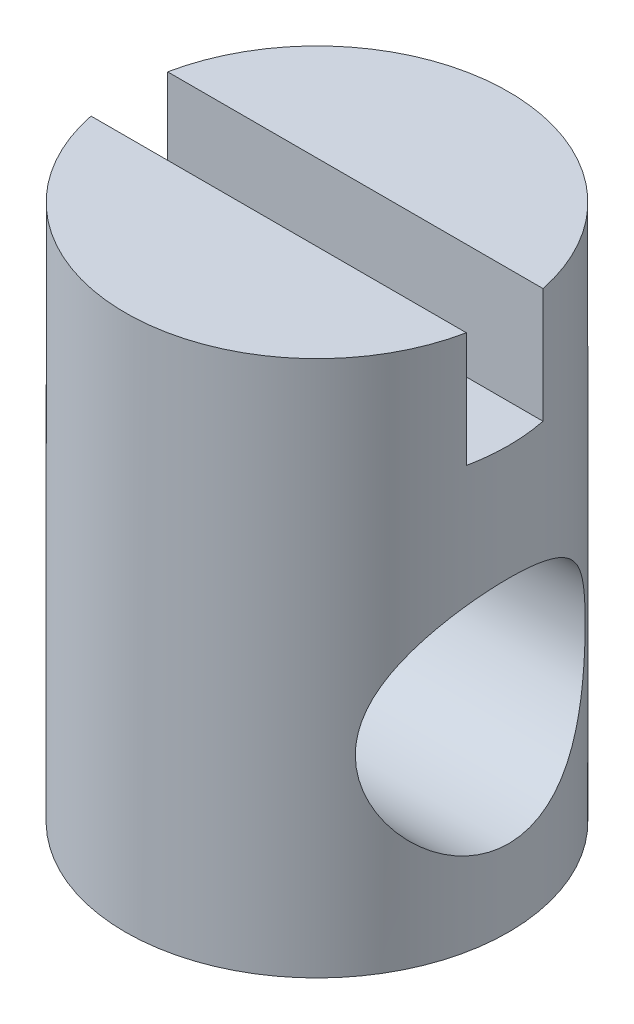
ISO-10303-21;
HEADER;
FILE_DESCRIPTION(('STEP AP214'),'2;1');
FILE_NAME('part.step','',(''),(''),'','','');
FILE_SCHEMA(('AUTOMOTIVE_DESIGN { 1 0 10303 214 1 1 1 1 }'));
ENDSEC;
DATA;
#1=APPLICATION_CONTEXT('core data for automotive mechanical design processes');
#2=APPLICATION_PROTOCOL_DEFINITION('international standard','automotive_design',2000,#1);
#3=PRODUCT_CONTEXT('',#1,'mechanical');
#4=PRODUCT('Part','Part','',(#3));
#5=PRODUCT_RELATED_PRODUCT_CATEGORY('part','',(#4));
#6=PRODUCT_DEFINITION_FORMATION('','',#4);
#7=PRODUCT_DEFINITION_CONTEXT('part definition',#1,'design');
#8=PRODUCT_DEFINITION('design','',#6,#7);
#9=PRODUCT_DEFINITION_SHAPE('','',#8);
#10=(LENGTH_UNIT() NAMED_UNIT(*) SI_UNIT(.MILLI.,.METRE.));
#11=(NAMED_UNIT(*) PLANE_ANGLE_UNIT() SI_UNIT($,.RADIAN.));
#12=(NAMED_UNIT(*) SI_UNIT($,.STERADIAN.) SOLID_ANGLE_UNIT());
#13=UNCERTAINTY_MEASURE_WITH_UNIT(LENGTH_MEASURE(1.E-05),#10,'distance_accuracy_value','');
#14=(GEOMETRIC_REPRESENTATION_CONTEXT(3) GLOBAL_UNCERTAINTY_ASSIGNED_CONTEXT((#13)) GLOBAL_UNIT_ASSIGNED_CONTEXT((#10,
#11,#12)) REPRESENTATION_CONTEXT('',''));
#15=CARTESIAN_POINT('',(0.,0.,0.));
#16=DIRECTION('',(0.,0.,1.));
#17=DIRECTION('',(1.,0.,0.));
#18=AXIS2_PLACEMENT_3D('',#15,#16,#17);
#19=CARTESIAN_POINT('',(0.,14.,0.));
#20=DIRECTION('',(0.,-1.,0.));
#21=DIRECTION('',(0.,0.,-1.));
#22=AXIS2_PLACEMENT_3D('',#19,#20,#21);
#23=CYLINDRICAL_SURFACE('',#22,5.);
#24=CARTESIAN_POINT('',(-4.,5.,3.));
#25=CARTESIAN_POINT('',(-3.99999997094658,5.07546161036566,2.9999999059924));
#26=CARTESIAN_POINT('',(-4.00214560778386,5.15091995182571,2.99714660074499));
#27=CARTESIAN_POINT('',(-4.01061905841259,5.30118357915588,2.98579602023829));
#28=CARTESIAN_POINT('',(-4.01694847458097,5.37598860368072,2.97729658251829));
#29=CARTESIAN_POINT('',(-4.04185988554313,5.59854240080013,2.94350195877));
#30=CARTESIAN_POINT('',(-4.06636523363867,5.74446616303865,2.90991036792577));
#31=CARTESIAN_POINT('',(-4.1272446631328,6.02619529387302,2.82286888064331));
#32=CARTESIAN_POINT('',(-4.16353284212727,6.16206540972155,2.76956233581239));
#33=CARTESIAN_POINT('',(-4.24371857831163,6.42286717142596,2.64505893939301));
#34=CARTESIAN_POINT('',(-4.28761840405594,6.54779553947816,2.57385675138361));
#35=CARTESIAN_POINT('',(-4.3845721143975,6.79990131024536,2.40542341931062));
#36=CARTESIAN_POINT('',(-4.43808896832273,6.92548608074574,2.30607419983945));
#37=CARTESIAN_POINT('',(-4.54452303763808,7.15952535636891,2.08854542159202));
#38=CARTESIAN_POINT('',(-4.59743977155758,7.26796690142325,1.97035175093534));
#39=CARTESIAN_POINT('',(-4.70351798165429,7.47628246871424,1.70284578042267));
#40=CARTESIAN_POINT('',(-4.75608869625048,7.57396641364106,1.55155129309905));
#41=CARTESIAN_POINT('',(-4.82570563669468,7.69974650858797,1.31132430439157));
#42=CARTESIAN_POINT('',(-4.84737661360987,7.73822411545812,1.22900736782604));
#43=CARTESIAN_POINT('',(-4.88701002756049,7.80779096487914,1.06047221299631));
#44=CARTESIAN_POINT('',(-4.90497491519086,7.83888509171157,0.974256618946846));
#45=CARTESIAN_POINT('',(-4.9351119388654,7.89062746245329,0.806968026671437));
#46=CARTESIAN_POINT('',(-4.94767216447126,7.9119872715291,0.726184158740188));
#47=CARTESIAN_POINT('',(-4.96892323787741,7.94794996135096,0.562666348744431));
#48=CARTESIAN_POINT('',(-4.97761624192487,7.9625566076376,0.479933520527564));
#49=CARTESIAN_POINT('',(-4.99087754875312,7.98478468451609,0.313244621267395));
#50=CARTESIAN_POINT('',(-4.99544805239181,7.9924098423118,0.229289227265367));
#51=CARTESIAN_POINT('',(-5.00033941607428,8.00056663984718,0.0609397888852063));
#52=CARTESIAN_POINT('',(-5.00066070848408,8.00109900129356,-0.0234542099897581));
#53=CARTESIAN_POINT('',(-4.99565270087357,7.99275721772026,-0.255171183646356));
#54=CARTESIAN_POINT('',(-4.98590479614142,7.97652885035085,-0.402219957267167));
#55=CARTESIAN_POINT('',(-4.95416390550291,7.92304450631758,-0.690956248818425));
#56=CARTESIAN_POINT('',(-4.9321700133334,7.8857869733895,-0.832643369131342));
#57=CARTESIAN_POINT('',(-4.87769707511975,7.79166776699805,-1.10810607069191));
#58=CARTESIAN_POINT('',(-4.84515792140775,7.73469357980008,-1.2418309672266));
#59=CARTESIAN_POINT('',(-4.77219304045846,7.60323106554831,-1.49797933560354));
#60=CARTESIAN_POINT('',(-4.73176526544935,7.52873818986414,-1.62039986081242));
#61=CARTESIAN_POINT('',(-4.64075842839173,7.35432172038148,-1.86614789799246));
#62=CARTESIAN_POINT('',(-4.58954363323803,7.2524233514645,-1.98783715480756));
#63=CARTESIAN_POINT('',(-4.48511110796775,7.03119178989514,-2.2134294892317));
#64=CARTESIAN_POINT('',(-4.43189074054161,6.91183500028095,-2.31730807434112));
#65=CARTESIAN_POINT('',(-4.32222149525339,6.64269317960225,-2.51649670159325));
#66=CARTESIAN_POINT('',(-4.26611322583747,6.4909848446704,-2.60941864927586));
#67=CARTESIAN_POINT('',(-4.16501759300692,6.17058753897334,-2.76794435835452));
#68=CARTESIAN_POINT('',(-4.12000980621702,6.00193056868576,-2.83359844351372));
#69=CARTESIAN_POINT('',(-4.05791730375361,5.69521273550437,-2.92154993808436));
#70=CARTESIAN_POINT('',(-4.03667777278559,5.55991873420767,-2.95055806318484));
#71=CARTESIAN_POINT('',(-4.00784301513238,5.28525278059874,-2.98961745817055));
#72=CARTESIAN_POINT('',(-4.00023192044755,5.1458857631155,-2.9996907751055));
#73=CARTESIAN_POINT('',(-3.9997782882838,4.86689663103837,-3.00029561322377));
#74=CARTESIAN_POINT('',(-4.00695621149423,4.72727443039828,-2.99080006076193));
#75=CARTESIAN_POINT('',(-4.03503040875294,4.45202532768623,-2.95280584471632));
#76=CARTESIAN_POINT('',(-4.05593752603304,4.31640167218009,-2.92429216045109));
#77=CARTESIAN_POINT('',(-4.10863539286051,4.05257078445052,-2.84976612867927));
#78=CARTESIAN_POINT('',(-4.14041253958232,3.92435451586245,-2.80377564381491));
#79=CARTESIAN_POINT('',(-4.21143069058874,3.67704477969248,-2.69592568264801));
#80=CARTESIAN_POINT('',(-4.25067450889246,3.5579547754061,-2.63406022035171));
#81=CARTESIAN_POINT('',(-4.34073681424694,3.3095189047537,-2.48334675803862));
#82=CARTESIAN_POINT('',(-4.39236652981539,3.18219456767056,-2.391645038527));
#83=CARTESIAN_POINT('',(-4.49643335252964,2.94343279605459,-2.18975614095891));
#84=CARTESIAN_POINT('',(-4.54887118822612,2.83201075390556,-2.07955127457131));
#85=CARTESIAN_POINT('',(-4.65671991538655,2.61353600868425,-1.82651475528323));
#86=CARTESIAN_POINT('',(-4.71163080343122,2.50893529423711,-1.68130397020029));
#87=CARTESIAN_POINT('',(-4.78599458202112,2.37184550227661,-1.44944631278512));
#88=CARTESIAN_POINT('',(-4.80945640676867,2.32943799786309,-1.36978605711653));
#89=CARTESIAN_POINT('',(-4.85305400686526,2.25169611652151,-1.20623656162325));
#90=CARTESIAN_POINT('',(-4.87319187464059,2.2163572868813,-1.12235002598574));
#91=CARTESIAN_POINT('',(-4.90820667253681,2.15552035676558,-0.957140698774941));
#92=CARTESIAN_POINT('',(-4.92335831278731,2.12949628153821,-0.87606946733799));
#93=CARTESIAN_POINT('',(-4.94982497459132,2.08433501839092,-0.711460619981308));
#94=CARTESIAN_POINT('',(-4.96114214594589,2.06519397112009,-0.627924414708837));
#95=CARTESIAN_POINT('',(-4.9795990393125,2.0340996902869,-0.459119615082284));
#96=CARTESIAN_POINT('',(-4.98674160560363,2.02214156263945,-0.373852241304049));
#97=CARTESIAN_POINT('',(-4.99664216975595,2.00559323834099,-0.202384159163476));
#98=CARTESIAN_POINT('',(-4.99940073918633,2.00100208121105,-0.116183573945421));
#99=CARTESIAN_POINT('',(-5.00079353601933,1.99867171024059,0.119519384080578));
#100=CARTESIAN_POINT('',(-4.99493619757571,2.0083989254259,0.269213134971584));
#101=CARTESIAN_POINT('',(-4.97026391444784,2.04978205414894,0.564325544477554));
#102=CARTESIAN_POINT('',(-4.95144882543497,2.08143821194009,0.709744155455478));
#103=CARTESIAN_POINT('',(-4.90298726022977,2.16444057064628,0.990283617430274));
#104=CARTESIAN_POINT('',(-4.87351900635897,2.215463439549,1.1255320564868));
#105=CARTESIAN_POINT('',(-4.8060670798365,2.33528094176348,1.38556595318151));
#106=CARTESIAN_POINT('',(-4.76808149787885,2.40407956034356,1.51034905620296));
#107=CARTESIAN_POINT('',(-4.68186861678972,2.56584990689575,1.76052652812014));
#108=CARTESIAN_POINT('',(-4.63297714592576,2.66063506352805,1.88451663454096));
#109=CARTESIAN_POINT('',(-4.5320378935883,2.86750842456549,2.11579577789689));
#110=CARTESIAN_POINT('',(-4.47998665474642,2.97961579766439,2.22306604531463));
#111=CARTESIAN_POINT('',(-4.37056449731608,3.23456104337874,2.43181699852643));
#112=CARTESIAN_POINT('',(-4.31335603990194,3.3794930844891,2.53083841179814));
#113=CARTESIAN_POINT('',(-4.20752457767503,3.68700957259526,2.70314606061125));
#114=CARTESIAN_POINT('',(-4.15889711577767,3.84958478419803,2.77644567607668));
#115=CARTESIAN_POINT('',(-4.10004730463765,4.09662255268763,2.86193484914579));
#116=CARTESIAN_POINT('',(-4.0832950867822,4.17565859129722,2.88571236613332));
#117=CARTESIAN_POINT('',(-4.05395087655969,4.33613044180016,2.92679381745552));
#118=CARTESIAN_POINT('',(-4.04135625254712,4.41756469998732,2.94410184772356));
#119=CARTESIAN_POINT('',(-4.0209497222627,4.58204655069405,2.97191221271433));
#120=CARTESIAN_POINT('',(-4.01313023377049,4.66509136837172,2.98242533831514));
#121=CARTESIAN_POINT('',(-4.00265571377826,4.83209221666361,2.99646884485439));
#122=CARTESIAN_POINT('',(-4.00000003232225,4.91604813126241,3.00000010458449));
#123=CARTESIAN_POINT('',(-4.,5.,3.));
#124=B_SPLINE_CURVE_WITH_KNOTS('',3,(#24,#25,#26,#27,#28,#29,#30,#31,#32,#33,#34,#35,#36,#37,
#38,#39,#40,#41,#42,#43,#44,#45,#46,#47,#48,#49,#50,#51,#52,#53,#54,#55,#56,#57,#58,#59,#60,#61,
#62,#63,#64,#65,#66,#67,#68,#69,#70,#71,#72,#73,#74,#75,#76,#77,#78,#79,#80,#81,#82,#83,#84,#85,
#86,#87,#88,#89,#90,#91,#92,#93,#94,#95,#96,#97,#98,#99,#100,#101,#102,#103,#104,#105,#106,#107,
#108,#109,#110,#111,#112,#113,#114,#115,#116,#117,#118,#119,#120,#121,#122,#123),.UNSPECIFIED.,
.T.,.F.,(4,2,2,2,2,2,2,2,2,2,2,2,2,2,2,2,2,2,2,2,2,2,2,2,2,2,2,2,2,2,2,2,2,2,2,2,2,2,2,2,2,2,2,
2,2,2,2,2,2,4),(0.,0.226288173517879,0.452663065091108,0.905305714765857,1.35471981612576,
1.80426809059901,2.30878181396805,2.81367513819685,3.37309572088444,3.65297634398311,
3.93267130287329,4.18580566749444,4.43879871451846,4.6916566173785,4.94448879122708,
5.38694235003539,5.82942865693064,6.27448283989929,6.71965270654932,7.21799594026829,
7.71701907227943,8.27387316194678,8.82969494223662,9.24786570023494,9.66554925202079,
10.0838110593649,10.5024036052238,10.9204742264512,11.3387027222345,11.8323285087813,
12.3264288987103,12.884776299373,13.1641700331408,13.4433872125907,13.7024631857776,
13.9613936663243,14.2201475237758,14.4788676430947,14.9267946196281,15.3747265854331,
15.8154875864153,16.2563474905318,16.7450674536299,17.2343321574792,17.7856420979722,
18.3366648323362,18.5890061072372,18.8411873492279,19.0929671157917,19.3447151893882),.UNSPECIFIED.);
#125=CARTESIAN_POINT('',(-4.,5.,3.));
#126=VERTEX_POINT('',#125);
#127=EDGE_CURVE('E108',#126,#126,#124,.T.);
#128=ORIENTED_EDGE('',*,*,#127,.F.);
#129=EDGE_LOOP('',(#128));
#130=FACE_BOUND('',#129,.T.);
#131=CARTESIAN_POINT('',(0.,11.,0.));
#132=DIRECTION('',(0.,-1.,0.));
#133=DIRECTION('',(0.,0.,-1.));
#134=AXIS2_PLACEMENT_3D('',#131,#132,#133);
#135=CIRCLE('',#134,5.);
#136=CARTESIAN_POINT('',(4.89897948556636,11.,-1.));
#137=VERTEX_POINT('',#136);
#138=CARTESIAN_POINT('',(4.89897948556636,11.,1.));
#139=VERTEX_POINT('',#138);
#140=EDGE_CURVE('E11',#137,#139,#135,.T.);
#141=ORIENTED_EDGE('',*,*,#140,.T.);
#142=DIRECTION('',(0.,-1.,0.));
#143=VECTOR('',#142,1.);
#144=CARTESIAN_POINT('',(4.89897948556636,14.,1.));
#145=LINE('',#144,#143);
#146=CARTESIAN_POINT('',(4.89897948556636,14.,1.));
#147=VERTEX_POINT('',#146);
#148=EDGE_CURVE('E63',#139,#147,#145,.F.);
#149=ORIENTED_EDGE('',*,*,#148,.T.);
#150=CARTESIAN_POINT('',(0.,14.,0.));
#151=DIRECTION('',(0.,1.,0.));
#152=DIRECTION('',(0.,0.,1.));
#153=AXIS2_PLACEMENT_3D('',#150,#151,#152);
#154=CIRCLE('',#153,5.);
#155=CARTESIAN_POINT('',(-4.89897948556636,14.,1.));
#156=VERTEX_POINT('',#155);
#157=EDGE_CURVE('E98',#156,#147,#154,.T.);
#158=ORIENTED_EDGE('',*,*,#157,.F.);
#159=DIRECTION('',(0.,-1.,0.));
#160=VECTOR('',#159,1.);
#161=CARTESIAN_POINT('',(-4.89897948556636,14.,1.));
#162=LINE('',#161,#160);
#163=CARTESIAN_POINT('',(-4.89897948556636,11.,1.));
#164=VERTEX_POINT('',#163);
#165=EDGE_CURVE('E104',#156,#164,#162,.T.);
#166=ORIENTED_EDGE('',*,*,#165,.T.);
#167=CARTESIAN_POINT('',(-4.89897948556636,11.,-1.));
#168=VERTEX_POINT('',#167);
#169=EDGE_CURVE('E47',#164,#168,#135,.T.);
#170=ORIENTED_EDGE('',*,*,#169,.T.);
#171=DIRECTION('',(0.,-1.,0.));
#172=VECTOR('',#171,1.);
#173=CARTESIAN_POINT('',(-4.89897948556636,14.,-1.));
#174=LINE('',#173,#172);
#175=CARTESIAN_POINT('',(-4.89897948556636,14.,-1.));
#176=VERTEX_POINT('',#175);
#177=EDGE_CURVE('E83',#168,#176,#174,.F.);
#178=ORIENTED_EDGE('',*,*,#177,.T.);
#179=CARTESIAN_POINT('',(4.89897948556636,14.,-1.));
#180=VERTEX_POINT('',#179);
#181=EDGE_CURVE('E89',#180,#176,#154,.T.);
#182=ORIENTED_EDGE('',*,*,#181,.F.);
#183=DIRECTION('',(0.,-1.,0.));
#184=VECTOR('',#183,1.);
#185=CARTESIAN_POINT('',(4.89897948556636,14.,-1.));
#186=LINE('',#185,#184);
#187=EDGE_CURVE('E55',#180,#137,#186,.T.);
#188=ORIENTED_EDGE('',*,*,#187,.T.);
#189=EDGE_LOOP('',(#141,#149,#158,#166,#170,#178,#182,#188));
#190=FACE_BOUND('',#189,.T.);
#191=CARTESIAN_POINT('',(0.,0.,0.));
#192=DIRECTION('',(0.,1.,0.));
#193=DIRECTION('',(0.,0.,1.));
#194=AXIS2_PLACEMENT_3D('',#191,#192,#193);
#195=CIRCLE('',#194,5.);
#196=CARTESIAN_POINT('',(0.,0.,5.));
#197=VERTEX_POINT('',#196);
#198=EDGE_CURVE('E101',#197,#197,#195,.T.);
#199=ORIENTED_EDGE('',*,*,#198,.T.);
#200=EDGE_LOOP('',(#199));
#201=FACE_BOUND('',#200,.T.);
#202=CARTESIAN_POINT('',(4.,5.,3.));
#203=CARTESIAN_POINT('',(3.99999997094658,4.92453838963434,2.9999999059924));
#204=CARTESIAN_POINT('',(4.00214560778386,4.84908004817429,2.99714660074499));
#205=CARTESIAN_POINT('',(4.01061905841259,4.69881642084412,2.98579602023829));
#206=CARTESIAN_POINT('',(4.01694847458097,4.62401139631928,2.97729658251829));
#207=CARTESIAN_POINT('',(4.04185988554313,4.40145759919987,2.94350195877));
#208=CARTESIAN_POINT('',(4.06636523363867,4.25553383696135,2.90991036792577));
#209=CARTESIAN_POINT('',(4.1272446631328,3.97380470612697,2.82286888064331));
#210=CARTESIAN_POINT('',(4.16353284212727,3.83793459027844,2.76956233581238));
#211=CARTESIAN_POINT('',(4.24371857831163,3.57713282857404,2.64505893939301));
#212=CARTESIAN_POINT('',(4.28761840405594,3.45220446052184,2.57385675138361));
#213=CARTESIAN_POINT('',(4.3845721143975,3.20009868975464,2.40542341931062));
#214=CARTESIAN_POINT('',(4.43808896832273,3.07451391925426,2.30607419983945));
#215=CARTESIAN_POINT('',(4.54452303763808,2.84047464363109,2.08854542159202));
#216=CARTESIAN_POINT('',(4.59743977155758,2.73203309857675,1.97035175093534));
#217=CARTESIAN_POINT('',(4.70351798165429,2.52371753128576,1.70284578042267));
#218=CARTESIAN_POINT('',(4.75608869625048,2.42603358635894,1.55155129309905));
#219=CARTESIAN_POINT('',(4.82570563669468,2.30025349141203,1.31132430439157));
#220=CARTESIAN_POINT('',(4.84737661360987,2.26177588454188,1.22900736782604));
#221=CARTESIAN_POINT('',(4.88701002756049,2.19220903512086,1.06047221299631));
#222=CARTESIAN_POINT('',(4.90497491519086,2.16111490828843,0.974256618946846));
#223=CARTESIAN_POINT('',(4.9351119388654,2.10937253754671,0.806968026671437));
#224=CARTESIAN_POINT('',(4.94767216447126,2.0880127284709,0.726184158740188));
#225=CARTESIAN_POINT('',(4.96892323787741,2.05205003864904,0.562666348744431));
#226=CARTESIAN_POINT('',(4.97761624192487,2.0374433923624,0.479933520527564));
#227=CARTESIAN_POINT('',(4.99087754875312,2.01521531548391,0.313244621267394));
#228=CARTESIAN_POINT('',(4.99544805239181,2.0075901576882,0.229289227265367));
#229=CARTESIAN_POINT('',(5.00033941607428,1.99943336015282,0.0609397888852059));
#230=CARTESIAN_POINT('',(5.00066070848408,1.99890099870644,-0.0234542099897585));
#231=CARTESIAN_POINT('',(4.99565270087357,2.00724278227974,-0.255171183646356));
#232=CARTESIAN_POINT('',(4.98590479614142,2.02347114964915,-0.402219957267168));
#233=CARTESIAN_POINT('',(4.95416390550291,2.07695549368242,-0.690956248818425));
#234=CARTESIAN_POINT('',(4.9321700133334,2.1142130266105,-0.832643369131342));
#235=CARTESIAN_POINT('',(4.87769707511975,2.20833223300195,-1.10810607069191));
#236=CARTESIAN_POINT('',(4.84515792140775,2.26530642019992,-1.2418309672266));
#237=CARTESIAN_POINT('',(4.77219304045846,2.39676893445169,-1.49797933560354));
#238=CARTESIAN_POINT('',(4.73176526544935,2.47126181013586,-1.62039986081242));
#239=CARTESIAN_POINT('',(4.64075842839173,2.64567827961852,-1.86614789799246));
#240=CARTESIAN_POINT('',(4.58954363323803,2.7475766485355,-1.98783715480756));
#241=CARTESIAN_POINT('',(4.48511110796775,2.96880821010486,-2.2134294892317));
#242=CARTESIAN_POINT('',(4.43189074054161,3.08816499971905,-2.31730807434112));
#243=CARTESIAN_POINT('',(4.32222149525339,3.35730682039775,-2.51649670159325));
#244=CARTESIAN_POINT('',(4.26611322583747,3.5090151553296,-2.60941864927586));
#245=CARTESIAN_POINT('',(4.16501759300692,3.82941246102666,-2.76794435835452));
#246=CARTESIAN_POINT('',(4.12000980621702,3.99806943131424,-2.83359844351372));
#247=CARTESIAN_POINT('',(4.05791730375361,4.30478726449563,-2.92154993808436));
#248=CARTESIAN_POINT('',(4.03667777278559,4.44008126579233,-2.95055806318484));
#249=CARTESIAN_POINT('',(4.00784301513238,4.71474721940126,-2.98961745817055));
#250=CARTESIAN_POINT('',(4.00023192044755,4.8541142368845,-2.9996907751055));
#251=CARTESIAN_POINT('',(3.9997782882838,5.13310336896163,-3.00029561322377));
#252=CARTESIAN_POINT('',(4.00695621149423,5.27272556960172,-2.99080006076193));
#253=CARTESIAN_POINT('',(4.03503040875294,5.54797467231377,-2.95280584471632));
#254=CARTESIAN_POINT('',(4.05593752603304,5.68359832781991,-2.92429216045109));
#255=CARTESIAN_POINT('',(4.10863539286051,5.94742921554948,-2.84976612867927));
#256=CARTESIAN_POINT('',(4.14041253958232,6.07564548413755,-2.80377564381491));
#257=CARTESIAN_POINT('',(4.21143069058874,6.32295522030752,-2.69592568264801));
#258=CARTESIAN_POINT('',(4.25067450889246,6.4420452245939,-2.63406022035171));
#259=CARTESIAN_POINT('',(4.34073681424694,6.6904810952463,-2.48334675803862));
#260=CARTESIAN_POINT('',(4.39236652981539,6.81780543232944,-2.391645038527));
#261=CARTESIAN_POINT('',(4.49643335252964,7.05656720394541,-2.18975614095891));
#262=CARTESIAN_POINT('',(4.54887118822612,7.16798924609444,-2.07955127457131));
#263=CARTESIAN_POINT('',(4.65671991538655,7.38646399131575,-1.82651475528323));
#264=CARTESIAN_POINT('',(4.71163080343122,7.49106470576289,-1.68130397020029));
#265=CARTESIAN_POINT('',(4.78599458202112,7.62815449772339,-1.44944631278512));
#266=CARTESIAN_POINT('',(4.80945640676867,7.67056200213691,-1.36978605711653));
#267=CARTESIAN_POINT('',(4.85305400686526,7.74830388347849,-1.20623656162325));
#268=CARTESIAN_POINT('',(4.87319187464059,7.7836427131187,-1.12235002598574));
#269=CARTESIAN_POINT('',(4.90820667253681,7.84447964323442,-0.957140698774941));
#270=CARTESIAN_POINT('',(4.92335831278731,7.87050371846179,-0.87606946733799));
#271=CARTESIAN_POINT('',(4.94982497459132,7.91566498160908,-0.711460619981309));
#272=CARTESIAN_POINT('',(4.96114214594589,7.93480602887991,-0.627924414708837));
#273=CARTESIAN_POINT('',(4.9795990393125,7.9659003097131,-0.459119615082285));
#274=CARTESIAN_POINT('',(4.98674160560363,7.97785843736056,-0.373852241304051));
#275=CARTESIAN_POINT('',(4.99664216975595,7.99440676165901,-0.202384159163477));
#276=CARTESIAN_POINT('',(4.99940073918633,7.99899791878895,-0.116183573945421));
#277=CARTESIAN_POINT('',(5.00079353601933,8.00132828975941,0.119519384080578));
#278=CARTESIAN_POINT('',(4.99493619757571,7.9916010745741,0.269213134971584));
#279=CARTESIAN_POINT('',(4.97026391444784,7.95021794585106,0.564325544477554));
#280=CARTESIAN_POINT('',(4.95144882543497,7.91856178805991,0.709744155455478));
#281=CARTESIAN_POINT('',(4.90298726022977,7.83555942935372,0.990283617430276));
#282=CARTESIAN_POINT('',(4.87351900635897,7.784536560451,1.1255320564868));
#283=CARTESIAN_POINT('',(4.8060670798365,7.66471905823652,1.38556595318152));
#284=CARTESIAN_POINT('',(4.76808149787885,7.59592043965644,1.51034905620296));
#285=CARTESIAN_POINT('',(4.68186861678971,7.43415009310425,1.76052652812014));
#286=CARTESIAN_POINT('',(4.63297714592576,7.33936493647195,1.88451663454096));
#287=CARTESIAN_POINT('',(4.5320378935883,7.13249157543451,2.11579577789689));
#288=CARTESIAN_POINT('',(4.47998665474642,7.02038420233561,2.22306604531463));
#289=CARTESIAN_POINT('',(4.37056449731608,6.76543895662126,2.43181699852643));
#290=CARTESIAN_POINT('',(4.31335603990194,6.6205069155109,2.53083841179814));
#291=CARTESIAN_POINT('',(4.20752457767503,6.31299042740474,2.70314606061125));
#292=CARTESIAN_POINT('',(4.15889711577767,6.15041521580197,2.77644567607668));
#293=CARTESIAN_POINT('',(4.10004730463765,5.90337744731237,2.86193484914579));
#294=CARTESIAN_POINT('',(4.0832950867822,5.82434140870278,2.88571236613332));
#295=CARTESIAN_POINT('',(4.05395087655969,5.66386955819984,2.92679381745552));
#296=CARTESIAN_POINT('',(4.04135625254712,5.58243530001268,2.94410184772356));
#297=CARTESIAN_POINT('',(4.0209497222627,5.41795344930594,2.97191221271433));
#298=CARTESIAN_POINT('',(4.01313023377049,5.33490863162828,2.98242533831514));
#299=CARTESIAN_POINT('',(4.00265571377826,5.16790778333639,2.99646884485439));
#300=CARTESIAN_POINT('',(4.00000003232225,5.08395186873759,3.00000010458449));
#301=CARTESIAN_POINT('',(4.,5.,3.));
#302=B_SPLINE_CURVE_WITH_KNOTS('',3,(#202,#203,#204,#205,#206,#207,#208,#209,#210,#211,#212,
#213,#214,#215,#216,#217,#218,#219,#220,#221,#222,#223,#224,#225,#226,#227,#228,#229,#230,#231,
#232,#233,#234,#235,#236,#237,#238,#239,#240,#241,#242,#243,#244,#245,#246,#247,#248,#249,#250,
#251,#252,#253,#254,#255,#256,#257,#258,#259,#260,#261,#262,#263,#264,#265,#266,#267,#268,#269,
#270,#271,#272,#273,#274,#275,#276,#277,#278,#279,#280,#281,#282,#283,#284,#285,#286,#287,#288,
#289,#290,#291,#292,#293,#294,#295,#296,#297,#298,#299,#300,#301),.UNSPECIFIED.,.T.,.F.,(4,2,2,
2,2,2,2,2,2,2,2,2,2,2,2,2,2,2,2,2,2,2,2,2,2,2,2,2,2,2,2,2,2,2,2,2,2,2,2,2,2,2,2,2,2,2,2,2,2,4),
(0.,0.226288173517879,0.452663065091108,0.905305714765857,1.35471981612576,1.80426809059901,
2.30878181396805,2.81367513819685,3.37309572088444,3.65297634398311,3.93267130287329,
4.18580566749444,4.43879871451846,4.69165661737851,4.94448879122708,5.38694235003539,
5.82942865693065,6.27448283989929,6.71965270654932,7.21799594026829,7.71701907227943,
8.27387316194679,8.82969494223662,9.24786570023494,9.66554925202079,10.0838110593649,
10.5024036052238,10.9204742264512,11.3387027222345,11.8323285087813,12.3264288987103,
12.884776299373,13.1641700331408,13.4433872125907,13.7024631857776,13.9613936663243,
14.2201475237758,14.4788676430947,14.9267946196281,15.3747265854331,15.8154875864153,
16.2563474905318,16.7450674536299,17.2343321574792,17.7856420979722,18.3366648323362,
18.5890061072372,18.8411873492279,19.0929671157917,19.3447151893882),.UNSPECIFIED.);
#303=CARTESIAN_POINT('',(4.,5.,3.));
#304=VERTEX_POINT('',#303);
#305=EDGE_CURVE('E39',#304,#304,#302,.T.);
#306=ORIENTED_EDGE('',*,*,#305,.F.);
#307=EDGE_LOOP('',(#306));
#308=FACE_BOUND('',#307,.T.);
#309=ADVANCED_FACE('F35',(#130,#190,#201,#308),#23,.T.);
#310=CARTESIAN_POINT('',(0.,14.,0.));
#311=DIRECTION('',(0.,1.,0.));
#312=DIRECTION('',(0.,0.,1.));
#313=AXIS2_PLACEMENT_3D('',#310,#311,#312);
#314=PLANE('',#313);
#315=DIRECTION('',(1.,0.,0.));
#316=VECTOR('',#315,1.);
#317=CARTESIAN_POINT('',(0.,14.,1.));
#318=LINE('',#317,#316);
#319=EDGE_CURVE('E88',#156,#147,#318,.T.);
#320=ORIENTED_EDGE('',*,*,#319,.F.);
#321=ORIENTED_EDGE('',*,*,#157,.T.);
#322=EDGE_LOOP('',(#320,#321));
#323=FACE_BOUND('',#322,.T.);
#324=ADVANCED_FACE('F129',(#323),#314,.T.);
#325=DIRECTION('',(-1.,0.,0.));
#326=VECTOR('',#325,1.);
#327=CARTESIAN_POINT('',(0.,14.,-1.));
#328=LINE('',#327,#326);
#329=EDGE_CURVE('E80',#180,#176,#328,.T.);
#330=ORIENTED_EDGE('',*,*,#329,.F.);
#331=ORIENTED_EDGE('',*,*,#181,.T.);
#332=EDGE_LOOP('',(#330,#331));
#333=FACE_BOUND('',#332,.T.);
#334=ADVANCED_FACE('F97',(#333),#314,.T.);
#335=CARTESIAN_POINT('',(0.,0.,0.));
#336=DIRECTION('',(0.,1.,0.));
#337=DIRECTION('',(0.,0.,1.));
#338=AXIS2_PLACEMENT_3D('',#335,#336,#337);
#339=PLANE('',#338);
#340=ORIENTED_EDGE('',*,*,#198,.F.);
#341=EDGE_LOOP('',(#340));
#342=FACE_BOUND('',#341,.T.);
#343=ADVANCED_FACE('F122',(#342),#339,.F.);
#344=CARTESIAN_POINT('',(0.,11.,0.));
#345=DIRECTION('',(0.,-1.,0.));
#346=DIRECTION('',(0.,0.,-1.));
#347=AXIS2_PLACEMENT_3D('',#344,#345,#346);
#348=PLANE('',#347);
#349=DIRECTION('',(-1.,0.,0.));
#350=VECTOR('',#349,1.);
#351=CARTESIAN_POINT('',(-6.9983976012942,11.,-1.));
#352=LINE('',#351,#350);
#353=EDGE_CURVE('E146',#137,#168,#352,.T.);
#354=ORIENTED_EDGE('',*,*,#353,.T.);
#355=ORIENTED_EDGE('',*,*,#169,.F.);
#356=DIRECTION('',(1.,0.,0.));
#357=VECTOR('',#356,1.);
#358=CARTESIAN_POINT('',(-6.9983976012942,11.,1.));
#359=LINE('',#358,#357);
#360=EDGE_CURVE('E95',#164,#139,#359,.T.);
#361=ORIENTED_EDGE('',*,*,#360,.T.);
#362=ORIENTED_EDGE('',*,*,#140,.F.);
#363=EDGE_LOOP('',(#354,#355,#361,#362));
#364=FACE_BOUND('',#363,.T.);
#365=ADVANCED_FACE('F117',(#364),#348,.F.);
#366=CARTESIAN_POINT('',(-6.9983976012942,11.,1.));
#367=DIRECTION('',(0.,0.,1.));
#368=DIRECTION('',(1.,0.,0.));
#369=AXIS2_PLACEMENT_3D('',#366,#367,#368);
#370=PLANE('',#369);
#371=ORIENTED_EDGE('',*,*,#319,.T.);
#372=ORIENTED_EDGE('',*,*,#148,.F.);
#373=ORIENTED_EDGE('',*,*,#360,.F.);
#374=ORIENTED_EDGE('',*,*,#165,.F.);
#375=EDGE_LOOP('',(#371,#372,#373,#374));
#376=FACE_BOUND('',#375,.T.);
#377=ADVANCED_FACE('F121',(#376),#370,.F.);
#378=CARTESIAN_POINT('',(-6.9983976012942,11.,-1.));
#379=DIRECTION('',(0.,0.,-1.));
#380=DIRECTION('',(-1.,0.,0.));
#381=AXIS2_PLACEMENT_3D('',#378,#379,#380);
#382=PLANE('',#381);
#383=ORIENTED_EDGE('',*,*,#329,.T.);
#384=ORIENTED_EDGE('',*,*,#177,.F.);
#385=ORIENTED_EDGE('',*,*,#353,.F.);
#386=ORIENTED_EDGE('',*,*,#187,.F.);
#387=EDGE_LOOP('',(#383,#384,#385,#386));
#388=FACE_BOUND('',#387,.T.);
#389=ADVANCED_FACE('F82',(#388),#382,.F.);
#390=CARTESIAN_POINT('',(13.,5.,0.));
#391=DIRECTION('',(-1.,0.,0.));
#392=DIRECTION('',(0.,0.,1.));
#393=AXIS2_PLACEMENT_3D('',#390,#391,#392);
#394=CYLINDRICAL_SURFACE('',#393,3.);
#395=ORIENTED_EDGE('',*,*,#127,.T.);
#396=EDGE_LOOP('',(#395));
#397=FACE_BOUND('',#396,.T.);
#398=ORIENTED_EDGE('',*,*,#305,.T.);
#399=EDGE_LOOP('',(#398));
#400=FACE_BOUND('',#399,.T.);
#401=ADVANCED_FACE('F112',(#397,#400),#394,.F.);
#402=CLOSED_SHELL('',(#309,#324,#334,#343,#365,#377,#389,#401));
#403=MANIFOLD_SOLID_BREP('B2',#402);
#404=ADVANCED_BREP_SHAPE_REPRESENTATION('',(#18,#403),#14);
#405=SHAPE_DEFINITION_REPRESENTATION(#9,#404);
ENDSEC;
END-ISO-10303-21;
